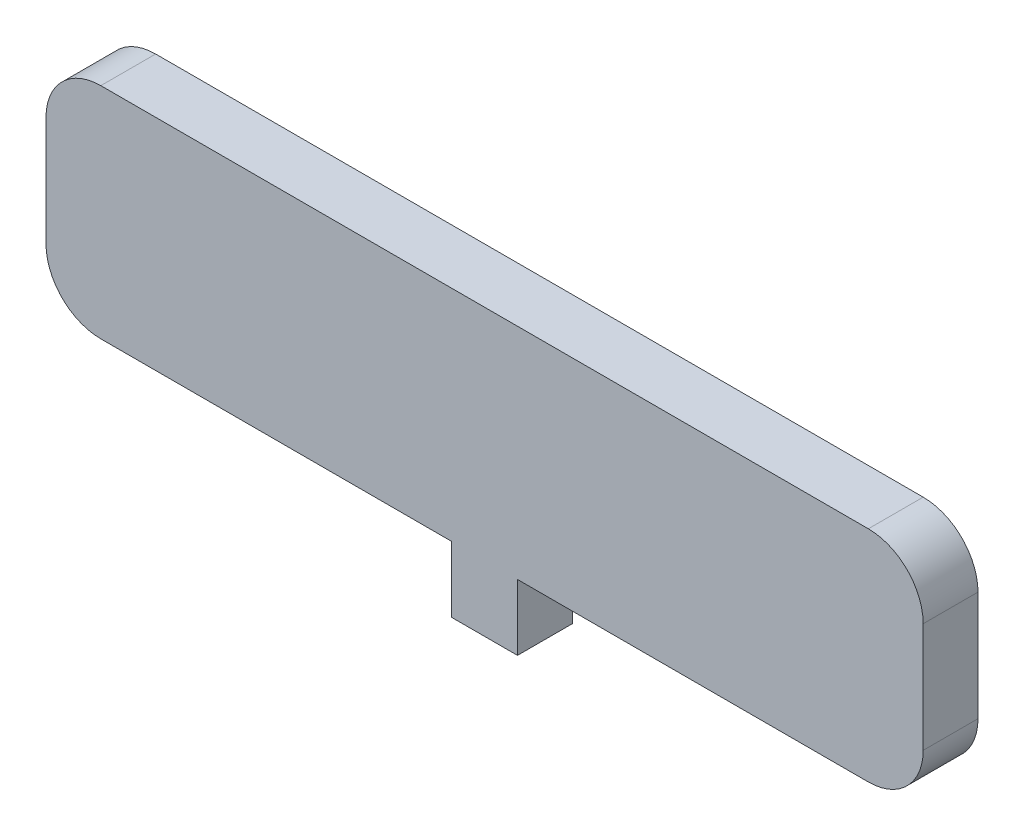
ISO-10303-21;
HEADER;
FILE_DESCRIPTION(('STEP AP214'),'2;1');
FILE_NAME('part.step','',(''),(''),'','','');
FILE_SCHEMA(('AUTOMOTIVE_DESIGN { 1 0 10303 214 1 1 1 1 }'));
ENDSEC;
DATA;
#1=APPLICATION_CONTEXT('core data for automotive mechanical design processes');
#2=APPLICATION_PROTOCOL_DEFINITION('international standard','automotive_design',2000,#1);
#3=PRODUCT_CONTEXT('',#1,'mechanical');
#4=PRODUCT('Part','Part','',(#3));
#5=PRODUCT_RELATED_PRODUCT_CATEGORY('part','',(#4));
#6=PRODUCT_DEFINITION_FORMATION('','',#4);
#7=PRODUCT_DEFINITION_CONTEXT('part definition',#1,'design');
#8=PRODUCT_DEFINITION('design','',#6,#7);
#9=PRODUCT_DEFINITION_SHAPE('','',#8);
#10=(LENGTH_UNIT() NAMED_UNIT(*) SI_UNIT(.MILLI.,.METRE.));
#11=(NAMED_UNIT(*) PLANE_ANGLE_UNIT() SI_UNIT($,.RADIAN.));
#12=(NAMED_UNIT(*) SI_UNIT($,.STERADIAN.) SOLID_ANGLE_UNIT());
#13=UNCERTAINTY_MEASURE_WITH_UNIT(LENGTH_MEASURE(1.E-05),#10,'distance_accuracy_value','');
#14=(GEOMETRIC_REPRESENTATION_CONTEXT(3) GLOBAL_UNCERTAINTY_ASSIGNED_CONTEXT((#13)) GLOBAL_UNIT_ASSIGNED_CONTEXT((#10,
#11,#12)) REPRESENTATION_CONTEXT('',''));
#15=CARTESIAN_POINT('',(0.,0.,0.));
#16=DIRECTION('',(0.,0.,1.));
#17=DIRECTION('',(1.,0.,0.));
#18=AXIS2_PLACEMENT_3D('',#15,#16,#17);
#19=CARTESIAN_POINT('',(-40.,-10.,5.));
#20=DIRECTION('',(0.,1.,0.));
#21=DIRECTION('',(0.,0.,1.));
#22=AXIS2_PLACEMENT_3D('',#19,#20,#21);
#23=PLANE('',#22);
#24=DIRECTION('',(0.,0.,1.));
#25=VECTOR('',#24,1.);
#26=CARTESIAN_POINT('',(3.,-10.,0.));
#27=LINE('',#26,#25);
#28=CARTESIAN_POINT('',(3.,-10.,0.));
#29=VERTEX_POINT('',#28);
#30=CARTESIAN_POINT('',(3.,-10.,5.));
#31=VERTEX_POINT('',#30);
#32=EDGE_CURVE('E55',#29,#31,#27,.T.);
#33=ORIENTED_EDGE('',*,*,#32,.F.);
#34=DIRECTION('',(1.,0.,0.));
#35=VECTOR('',#34,1.);
#36=CARTESIAN_POINT('',(-40.,-10.,0.));
#37=LINE('',#36,#35);
#38=CARTESIAN_POINT('',(35.,-10.,0.));
#39=VERTEX_POINT('',#38);
#40=EDGE_CURVE('E317',#29,#39,#37,.T.);
#41=ORIENTED_EDGE('',*,*,#40,.T.);
#42=DIRECTION('',(0.,0.,-1.));
#43=VECTOR('',#42,1.);
#44=CARTESIAN_POINT('',(35.,-10.,5.));
#45=LINE('',#44,#43);
#46=CARTESIAN_POINT('',(35.,-10.,5.));
#47=VERTEX_POINT('',#46);
#48=EDGE_CURVE('E359',#39,#47,#45,.F.);
#49=ORIENTED_EDGE('',*,*,#48,.T.);
#50=DIRECTION('',(1.,0.,0.));
#51=VECTOR('',#50,1.);
#52=CARTESIAN_POINT('',(-40.,-10.,5.));
#53=LINE('',#52,#51);
#54=EDGE_CURVE('E301',#31,#47,#53,.T.);
#55=ORIENTED_EDGE('',*,*,#54,.F.);
#56=EDGE_LOOP('',(#33,#41,#49,#55));
#57=FACE_BOUND('',#56,.T.);
#58=ADVANCED_FACE('F39',(#57),#23,.F.);
#59=CARTESIAN_POINT('',(0.,0.,0.));
#60=DIRECTION('',(0.,0.,1.));
#61=DIRECTION('',(1.,0.,0.));
#62=AXIS2_PLACEMENT_3D('',#59,#60,#61);
#63=PLANE('',#62);
#64=DIRECTION('',(0.,-1.,0.));
#65=VECTOR('',#64,1.);
#66=CARTESIAN_POINT('',(-40.,10.,0.));
#67=LINE('',#66,#65);
#68=CARTESIAN_POINT('',(-40.,5.,0.));
#69=VERTEX_POINT('',#68);
#70=CARTESIAN_POINT('',(-40.,-5.,0.));
#71=VERTEX_POINT('',#70);
#72=EDGE_CURVE('E313',#69,#71,#67,.T.);
#73=ORIENTED_EDGE('',*,*,#72,.F.);
#74=CARTESIAN_POINT('',(-35.,5.,0.));
#75=DIRECTION('',(0.,0.,1.));
#76=DIRECTION('',(1.,0.,0.));
#77=AXIS2_PLACEMENT_3D('',#74,#75,#76);
#78=CIRCLE('',#77,5.);
#79=CARTESIAN_POINT('',(-35.,10.,0.));
#80=VERTEX_POINT('',#79);
#81=EDGE_CURVE('E337',#69,#80,#78,.F.);
#82=ORIENTED_EDGE('',*,*,#81,.T.);
#83=DIRECTION('',(-1.,0.,0.));
#84=VECTOR('',#83,1.);
#85=CARTESIAN_POINT('',(-40.,10.,0.));
#86=LINE('',#85,#84);
#87=CARTESIAN_POINT('',(35.,10.,0.));
#88=VERTEX_POINT('',#87);
#89=EDGE_CURVE('E309',#88,#80,#86,.T.);
#90=ORIENTED_EDGE('',*,*,#89,.F.);
#91=CARTESIAN_POINT('',(35.,5.,0.));
#92=DIRECTION('',(0.,0.,1.));
#93=DIRECTION('',(1.,0.,0.));
#94=AXIS2_PLACEMENT_3D('',#91,#92,#93);
#95=CIRCLE('',#94,5.);
#96=CARTESIAN_POINT('',(40.,5.,0.));
#97=VERTEX_POINT('',#96);
#98=EDGE_CURVE('E327',#88,#97,#95,.F.);
#99=ORIENTED_EDGE('',*,*,#98,.T.);
#100=DIRECTION('',(0.,1.,0.));
#101=VECTOR('',#100,1.);
#102=CARTESIAN_POINT('',(40.,10.,0.));
#103=LINE('',#102,#101);
#104=CARTESIAN_POINT('',(40.,-5.,0.));
#105=VERTEX_POINT('',#104);
#106=EDGE_CURVE('E223',#105,#97,#103,.T.);
#107=ORIENTED_EDGE('',*,*,#106,.F.);
#108=CARTESIAN_POINT('',(35.,-5.,0.));
#109=DIRECTION('',(0.,0.,1.));
#110=DIRECTION('',(1.,0.,0.));
#111=AXIS2_PLACEMENT_3D('',#108,#109,#110);
#112=CIRCLE('',#111,5.);
#113=EDGE_CURVE('E330',#105,#39,#112,.F.);
#114=ORIENTED_EDGE('',*,*,#113,.T.);
#115=ORIENTED_EDGE('',*,*,#40,.F.);
#116=DIRECTION('',(0.,1.,0.));
#117=VECTOR('',#116,1.);
#118=CARTESIAN_POINT('',(3.,-16.,0.));
#119=LINE('',#118,#117);
#120=CARTESIAN_POINT('',(3.,-16.,0.));
#121=VERTEX_POINT('',#120);
#122=EDGE_CURVE('E406',#121,#29,#119,.T.);
#123=ORIENTED_EDGE('',*,*,#122,.F.);
#124=DIRECTION('',(-1.,0.,0.));
#125=VECTOR('',#124,1.);
#126=CARTESIAN_POINT('',(3.,-16.,0.));
#127=LINE('',#126,#125);
#128=CARTESIAN_POINT('',(-3.,-16.,0.));
#129=VERTEX_POINT('',#128);
#130=EDGE_CURVE('E198',#121,#129,#127,.T.);
#131=ORIENTED_EDGE('',*,*,#130,.T.);
#132=DIRECTION('',(0.,1.,0.));
#133=VECTOR('',#132,1.);
#134=CARTESIAN_POINT('',(-3.,-16.,0.));
#135=LINE('',#134,#133);
#136=CARTESIAN_POINT('',(-3.,-10.,0.));
#137=VERTEX_POINT('',#136);
#138=EDGE_CURVE('E211',#129,#137,#135,.T.);
#139=ORIENTED_EDGE('',*,*,#138,.T.);
#140=CARTESIAN_POINT('',(-35.,-10.,0.));
#141=VERTEX_POINT('',#140);
#142=EDGE_CURVE('E294',#141,#137,#37,.T.);
#143=ORIENTED_EDGE('',*,*,#142,.F.);
#144=CARTESIAN_POINT('',(-35.,-5.,0.));
#145=DIRECTION('',(0.,0.,1.));
#146=DIRECTION('',(1.,0.,0.));
#147=AXIS2_PLACEMENT_3D('',#144,#145,#146);
#148=CIRCLE('',#147,5.);
#149=EDGE_CURVE('E334',#141,#71,#148,.F.);
#150=ORIENTED_EDGE('',*,*,#149,.T.);
#151=EDGE_LOOP('',(#73,#82,#90,#99,#107,#114,#115,#123,#131,#139,#143,#150));
#152=FACE_BOUND('',#151,.T.);
#153=CARTESIAN_POINT('',(-35.,5.,0.));
#154=DIRECTION('',(0.,0.,1.));
#155=DIRECTION('',(1.,0.,0.));
#156=AXIS2_PLACEMENT_3D('',#153,#154,#155);
#157=CIRCLE('',#156,3.);
#158=CARTESIAN_POINT('',(-38.,5.,0.));
#159=VERTEX_POINT('',#158);
#160=CARTESIAN_POINT('',(-35.,8.,0.));
#161=VERTEX_POINT('',#160);
#162=EDGE_CURVE('E259',#159,#161,#157,.F.);
#163=ORIENTED_EDGE('',*,*,#162,.F.);
#164=DIRECTION('',(0.,-1.,0.));
#165=VECTOR('',#164,1.);
#166=CARTESIAN_POINT('',(-38.,10.,0.));
#167=LINE('',#166,#165);
#168=CARTESIAN_POINT('',(-38.,-5.,0.));
#169=VERTEX_POINT('',#168);
#170=EDGE_CURVE('E276',#159,#169,#167,.T.);
#171=ORIENTED_EDGE('',*,*,#170,.T.);
#172=CARTESIAN_POINT('',(-35.,-5.,0.));
#173=DIRECTION('',(0.,0.,1.));
#174=DIRECTION('',(1.,0.,0.));
#175=AXIS2_PLACEMENT_3D('',#172,#173,#174);
#176=CIRCLE('',#175,3.);
#177=CARTESIAN_POINT('',(-35.,-8.,0.));
#178=VERTEX_POINT('',#177);
#179=EDGE_CURVE('E273',#178,#169,#176,.F.);
#180=ORIENTED_EDGE('',*,*,#179,.F.);
#181=DIRECTION('',(1.,0.,0.));
#182=VECTOR('',#181,1.);
#183=CARTESIAN_POINT('',(-40.,-8.,0.));
#184=LINE('',#183,#182);
#185=CARTESIAN_POINT('',(35.,-8.,0.));
#186=VERTEX_POINT('',#185);
#187=EDGE_CURVE('E63',#178,#186,#184,.T.);
#188=ORIENTED_EDGE('',*,*,#187,.T.);
#189=CARTESIAN_POINT('',(35.,-5.,0.));
#190=DIRECTION('',(0.,0.,1.));
#191=DIRECTION('',(1.,0.,0.));
#192=AXIS2_PLACEMENT_3D('',#189,#190,#191);
#193=CIRCLE('',#192,3.);
#194=CARTESIAN_POINT('',(38.,-5.,0.));
#195=VERTEX_POINT('',#194);
#196=EDGE_CURVE('E270',#195,#186,#193,.F.);
#197=ORIENTED_EDGE('',*,*,#196,.F.);
#198=DIRECTION('',(0.,1.,0.));
#199=VECTOR('',#198,1.);
#200=CARTESIAN_POINT('',(38.,10.,0.));
#201=LINE('',#200,#199);
#202=CARTESIAN_POINT('',(38.,5.,0.));
#203=VERTEX_POINT('',#202);
#204=EDGE_CURVE('E204',#195,#203,#201,.T.);
#205=ORIENTED_EDGE('',*,*,#204,.T.);
#206=CARTESIAN_POINT('',(35.,5.,0.));
#207=DIRECTION('',(0.,0.,1.));
#208=DIRECTION('',(1.,0.,0.));
#209=AXIS2_PLACEMENT_3D('',#206,#207,#208);
#210=CIRCLE('',#209,3.);
#211=CARTESIAN_POINT('',(35.,8.,0.));
#212=VERTEX_POINT('',#211);
#213=EDGE_CURVE('E263',#212,#203,#210,.F.);
#214=ORIENTED_EDGE('',*,*,#213,.F.);
#215=DIRECTION('',(-1.,0.,0.));
#216=VECTOR('',#215,1.);
#217=CARTESIAN_POINT('',(-40.,8.,0.));
#218=LINE('',#217,#216);
#219=EDGE_CURVE('E209',#212,#161,#218,.T.);
#220=ORIENTED_EDGE('',*,*,#219,.T.);
#221=EDGE_LOOP('',(#163,#171,#180,#188,#197,#205,#214,#220));
#222=FACE_BOUND('',#221,.T.);
#223=ADVANCED_FACE('F384',(#152,#222),#63,.F.);
#224=CARTESIAN_POINT('',(40.,10.,5.));
#225=DIRECTION('',(-1.,0.,0.));
#226=DIRECTION('',(0.,0.,1.));
#227=AXIS2_PLACEMENT_3D('',#224,#225,#226);
#228=PLANE('',#227);
#229=DIRECTION('',(0.,1.,0.));
#230=VECTOR('',#229,1.);
#231=CARTESIAN_POINT('',(40.,10.,5.));
#232=LINE('',#231,#230);
#233=CARTESIAN_POINT('',(40.,-5.,5.));
#234=VERTEX_POINT('',#233);
#235=CARTESIAN_POINT('',(40.,5.,5.));
#236=VERTEX_POINT('',#235);
#237=EDGE_CURVE('E289',#234,#236,#232,.T.);
#238=ORIENTED_EDGE('',*,*,#237,.F.);
#239=DIRECTION('',(0.,0.,-1.));
#240=VECTOR('',#239,1.);
#241=CARTESIAN_POINT('',(40.,-5.,5.));
#242=LINE('',#241,#240);
#243=EDGE_CURVE('E11',#234,#105,#242,.T.);
#244=ORIENTED_EDGE('',*,*,#243,.T.);
#245=ORIENTED_EDGE('',*,*,#106,.T.);
#246=DIRECTION('',(0.,0.,-1.));
#247=VECTOR('',#246,1.);
#248=CARTESIAN_POINT('',(40.,5.,5.));
#249=LINE('',#248,#247);
#250=EDGE_CURVE('E48',#97,#236,#249,.F.);
#251=ORIENTED_EDGE('',*,*,#250,.T.);
#252=EDGE_LOOP('',(#238,#244,#245,#251));
#253=FACE_BOUND('',#252,.T.);
#254=ADVANCED_FACE('F370',(#253),#228,.F.);
#255=CARTESIAN_POINT('',(-40.,10.,5.));
#256=DIRECTION('',(0.,-1.,0.));
#257=DIRECTION('',(0.,0.,-1.));
#258=AXIS2_PLACEMENT_3D('',#255,#256,#257);
#259=PLANE('',#258);
#260=ORIENTED_EDGE('',*,*,#89,.T.);
#261=DIRECTION('',(0.,0.,-1.));
#262=VECTOR('',#261,1.);
#263=CARTESIAN_POINT('',(-35.,10.,5.));
#264=LINE('',#263,#262);
#265=CARTESIAN_POINT('',(-35.,10.,5.));
#266=VERTEX_POINT('',#265);
#267=EDGE_CURVE('E344',#80,#266,#264,.F.);
#268=ORIENTED_EDGE('',*,*,#267,.T.);
#269=DIRECTION('',(-1.,0.,0.));
#270=VECTOR('',#269,1.);
#271=CARTESIAN_POINT('',(-40.,10.,5.));
#272=LINE('',#271,#270);
#273=CARTESIAN_POINT('',(35.,10.,5.));
#274=VERTEX_POINT('',#273);
#275=EDGE_CURVE('E293',#274,#266,#272,.T.);
#276=ORIENTED_EDGE('',*,*,#275,.F.);
#277=DIRECTION('',(0.,0.,-1.));
#278=VECTOR('',#277,1.);
#279=CARTESIAN_POINT('',(35.,10.,5.));
#280=LINE('',#279,#278);
#281=EDGE_CURVE('E340',#274,#88,#280,.T.);
#282=ORIENTED_EDGE('',*,*,#281,.T.);
#283=EDGE_LOOP('',(#260,#268,#276,#282));
#284=FACE_BOUND('',#283,.T.);
#285=ADVANCED_FACE('F380',(#284),#259,.F.);
#286=CARTESIAN_POINT('',(-40.,10.,5.));
#287=DIRECTION('',(1.,0.,0.));
#288=DIRECTION('',(0.,1.,0.));
#289=AXIS2_PLACEMENT_3D('',#286,#287,#288);
#290=PLANE('',#289);
#291=DIRECTION('',(0.,-1.,0.));
#292=VECTOR('',#291,1.);
#293=CARTESIAN_POINT('',(-40.,10.,5.));
#294=LINE('',#293,#292);
#295=CARTESIAN_POINT('',(-40.,5.,5.));
#296=VERTEX_POINT('',#295);
#297=CARTESIAN_POINT('',(-40.,-5.,5.));
#298=VERTEX_POINT('',#297);
#299=EDGE_CURVE('E297',#296,#298,#294,.T.);
#300=ORIENTED_EDGE('',*,*,#299,.F.);
#301=DIRECTION('',(0.,0.,-1.));
#302=VECTOR('',#301,1.);
#303=CARTESIAN_POINT('',(-40.,5.,5.));
#304=LINE('',#303,#302);
#305=EDGE_CURVE('E323',#296,#69,#304,.T.);
#306=ORIENTED_EDGE('',*,*,#305,.T.);
#307=ORIENTED_EDGE('',*,*,#72,.T.);
#308=DIRECTION('',(0.,0.,-1.));
#309=VECTOR('',#308,1.);
#310=CARTESIAN_POINT('',(-40.,-5.,5.));
#311=LINE('',#310,#309);
#312=EDGE_CURVE('E305',#71,#298,#311,.F.);
#313=ORIENTED_EDGE('',*,*,#312,.T.);
#314=EDGE_LOOP('',(#300,#306,#307,#313));
#315=FACE_BOUND('',#314,.T.);
#316=ADVANCED_FACE('F392',(#315),#290,.F.);
#317=ORIENTED_EDGE('',*,*,#142,.T.);
#318=DIRECTION('',(0.,0.,1.));
#319=VECTOR('',#318,1.);
#320=CARTESIAN_POINT('',(-3.,-10.,0.));
#321=LINE('',#320,#319);
#322=CARTESIAN_POINT('',(-3.,-10.,5.));
#323=VERTEX_POINT('',#322);
#324=EDGE_CURVE('E200',#137,#323,#321,.T.);
#325=ORIENTED_EDGE('',*,*,#324,.T.);
#326=CARTESIAN_POINT('',(-35.,-10.,5.));
#327=VERTEX_POINT('',#326);
#328=EDGE_CURVE('E302',#327,#323,#53,.T.);
#329=ORIENTED_EDGE('',*,*,#328,.F.);
#330=DIRECTION('',(0.,0.,-1.));
#331=VECTOR('',#330,1.);
#332=CARTESIAN_POINT('',(-35.,-10.,5.));
#333=LINE('',#332,#331);
#334=EDGE_CURVE('E363',#327,#141,#333,.T.);
#335=ORIENTED_EDGE('',*,*,#334,.T.);
#336=EDGE_LOOP('',(#317,#325,#329,#335));
#337=FACE_BOUND('',#336,.T.);
#338=ADVANCED_FACE('F401',(#337),#23,.F.);
#339=CARTESIAN_POINT('',(0.,0.,5.));
#340=DIRECTION('',(0.,0.,1.));
#341=DIRECTION('',(1.,0.,0.));
#342=AXIS2_PLACEMENT_3D('',#339,#340,#341);
#343=PLANE('',#342);
#344=ORIENTED_EDGE('',*,*,#275,.T.);
#345=CARTESIAN_POINT('',(-35.,5.,5.));
#346=DIRECTION('',(0.,0.,1.));
#347=DIRECTION('',(1.,0.,0.));
#348=AXIS2_PLACEMENT_3D('',#345,#346,#347);
#349=CIRCLE('',#348,5.);
#350=EDGE_CURVE('E356',#266,#296,#349,.T.);
#351=ORIENTED_EDGE('',*,*,#350,.T.);
#352=ORIENTED_EDGE('',*,*,#299,.T.);
#353=CARTESIAN_POINT('',(-35.,-5.,5.));
#354=DIRECTION('',(0.,0.,1.));
#355=DIRECTION('',(1.,0.,0.));
#356=AXIS2_PLACEMENT_3D('',#353,#354,#355);
#357=CIRCLE('',#356,5.);
#358=EDGE_CURVE('E353',#298,#327,#357,.T.);
#359=ORIENTED_EDGE('',*,*,#358,.T.);
#360=ORIENTED_EDGE('',*,*,#328,.T.);
#361=DIRECTION('',(0.,1.,0.));
#362=VECTOR('',#361,1.);
#363=CARTESIAN_POINT('',(-3.,-16.,5.));
#364=LINE('',#363,#362);
#365=CARTESIAN_POINT('',(-3.,-16.,5.));
#366=VERTEX_POINT('',#365);
#367=EDGE_CURVE('E186',#366,#323,#364,.T.);
#368=ORIENTED_EDGE('',*,*,#367,.F.);
#369=DIRECTION('',(-1.,0.,0.));
#370=VECTOR('',#369,1.);
#371=CARTESIAN_POINT('',(3.,-16.,5.));
#372=LINE('',#371,#370);
#373=CARTESIAN_POINT('',(3.,-16.,5.));
#374=VERTEX_POINT('',#373);
#375=EDGE_CURVE('E179',#374,#366,#372,.T.);
#376=ORIENTED_EDGE('',*,*,#375,.F.);
#377=DIRECTION('',(0.,1.,0.));
#378=VECTOR('',#377,1.);
#379=CARTESIAN_POINT('',(3.,-16.,5.));
#380=LINE('',#379,#378);
#381=EDGE_CURVE('E183',#374,#31,#380,.T.);
#382=ORIENTED_EDGE('',*,*,#381,.T.);
#383=ORIENTED_EDGE('',*,*,#54,.T.);
#384=CARTESIAN_POINT('',(35.,-5.,5.));
#385=DIRECTION('',(0.,0.,1.));
#386=DIRECTION('',(1.,0.,0.));
#387=AXIS2_PLACEMENT_3D('',#384,#385,#386);
#388=CIRCLE('',#387,5.);
#389=EDGE_CURVE('E350',#47,#234,#388,.T.);
#390=ORIENTED_EDGE('',*,*,#389,.T.);
#391=ORIENTED_EDGE('',*,*,#237,.T.);
#392=CARTESIAN_POINT('',(35.,5.,5.));
#393=DIRECTION('',(0.,0.,1.));
#394=DIRECTION('',(1.,0.,0.));
#395=AXIS2_PLACEMENT_3D('',#392,#393,#394);
#396=CIRCLE('',#395,5.);
#397=EDGE_CURVE('E347',#236,#274,#396,.T.);
#398=ORIENTED_EDGE('',*,*,#397,.T.);
#399=EDGE_LOOP('',(#344,#351,#352,#359,#360,#368,#376,#382,#383,#390,#391,#398));
#400=FACE_BOUND('',#399,.T.);
#401=ADVANCED_FACE('F182',(#400),#343,.T.);
#402=CARTESIAN_POINT('',(-35.,5.,5.));
#403=DIRECTION('',(0.,0.,-1.));
#404=DIRECTION('',(-1.,0.,0.));
#405=AXIS2_PLACEMENT_3D('',#402,#403,#404);
#406=CYLINDRICAL_SURFACE('',#405,5.);
#407=ORIENTED_EDGE('',*,*,#350,.F.);
#408=ORIENTED_EDGE('',*,*,#267,.F.);
#409=ORIENTED_EDGE('',*,*,#81,.F.);
#410=ORIENTED_EDGE('',*,*,#305,.F.);
#411=EDGE_LOOP('',(#407,#408,#409,#410));
#412=FACE_BOUND('',#411,.T.);
#413=ADVANCED_FACE('F389',(#412),#406,.T.);
#414=CARTESIAN_POINT('',(-35.,-5.,5.));
#415=DIRECTION('',(0.,0.,-1.));
#416=DIRECTION('',(-1.,0.,0.));
#417=AXIS2_PLACEMENT_3D('',#414,#415,#416);
#418=CYLINDRICAL_SURFACE('',#417,5.);
#419=ORIENTED_EDGE('',*,*,#358,.F.);
#420=ORIENTED_EDGE('',*,*,#312,.F.);
#421=ORIENTED_EDGE('',*,*,#149,.F.);
#422=ORIENTED_EDGE('',*,*,#334,.F.);
#423=EDGE_LOOP('',(#419,#420,#421,#422));
#424=FACE_BOUND('',#423,.T.);
#425=ADVANCED_FACE('F398',(#424),#418,.T.);
#426=CARTESIAN_POINT('',(35.,-5.,5.));
#427=DIRECTION('',(0.,0.,-1.));
#428=DIRECTION('',(-1.,0.,0.));
#429=AXIS2_PLACEMENT_3D('',#426,#427,#428);
#430=CYLINDRICAL_SURFACE('',#429,5.);
#431=ORIENTED_EDGE('',*,*,#389,.F.);
#432=ORIENTED_EDGE('',*,*,#48,.F.);
#433=ORIENTED_EDGE('',*,*,#113,.F.);
#434=ORIENTED_EDGE('',*,*,#243,.F.);
#435=EDGE_LOOP('',(#431,#432,#433,#434));
#436=FACE_BOUND('',#435,.T.);
#437=ADVANCED_FACE('F466',(#436),#430,.T.);
#438=CARTESIAN_POINT('',(35.,5.,5.));
#439=DIRECTION('',(0.,0.,-1.));
#440=DIRECTION('',(-1.,0.,0.));
#441=AXIS2_PLACEMENT_3D('',#438,#439,#440);
#442=CYLINDRICAL_SURFACE('',#441,5.);
#443=ORIENTED_EDGE('',*,*,#397,.F.);
#444=ORIENTED_EDGE('',*,*,#250,.F.);
#445=ORIENTED_EDGE('',*,*,#98,.F.);
#446=ORIENTED_EDGE('',*,*,#281,.F.);
#447=EDGE_LOOP('',(#443,#444,#445,#446));
#448=FACE_BOUND('',#447,.T.);
#449=ADVANCED_FACE('F41',(#448),#442,.T.);
#450=CARTESIAN_POINT('',(38.,10.,5.));
#451=DIRECTION('',(-1.,0.,0.));
#452=DIRECTION('',(0.,0.,1.));
#453=AXIS2_PLACEMENT_3D('',#450,#451,#452);
#454=PLANE('',#453);
#455=DIRECTION('',(0.,1.,0.));
#456=VECTOR('',#455,1.);
#457=CARTESIAN_POINT('',(38.,10.,3.));
#458=LINE('',#457,#456);
#459=CARTESIAN_POINT('',(38.,-5.,3.));
#460=VERTEX_POINT('',#459);
#461=CARTESIAN_POINT('',(38.,5.,3.));
#462=VERTEX_POINT('',#461);
#463=EDGE_CURVE('E215',#460,#462,#458,.T.);
#464=ORIENTED_EDGE('',*,*,#463,.T.);
#465=DIRECTION('',(0.,0.,1.));
#466=VECTOR('',#465,1.);
#467=CARTESIAN_POINT('',(38.,5.,5.));
#468=LINE('',#467,#466);
#469=EDGE_CURVE('E224',#203,#462,#468,.T.);
#470=ORIENTED_EDGE('',*,*,#469,.F.);
#471=ORIENTED_EDGE('',*,*,#204,.F.);
#472=DIRECTION('',(0.,0.,1.));
#473=VECTOR('',#472,1.);
#474=CARTESIAN_POINT('',(38.,-5.,5.));
#475=LINE('',#474,#473);
#476=EDGE_CURVE('E220',#460,#195,#475,.F.);
#477=ORIENTED_EDGE('',*,*,#476,.F.);
#478=EDGE_LOOP('',(#464,#470,#471,#477));
#479=FACE_BOUND('',#478,.T.);
#480=ADVANCED_FACE('F472',(#479),#454,.T.);
#481=CARTESIAN_POINT('',(-40.,8.,5.));
#482=DIRECTION('',(0.,-1.,0.));
#483=DIRECTION('',(0.,0.,-1.));
#484=AXIS2_PLACEMENT_3D('',#481,#482,#483);
#485=PLANE('',#484);
#486=ORIENTED_EDGE('',*,*,#219,.F.);
#487=DIRECTION('',(0.,0.,-1.));
#488=VECTOR('',#487,1.);
#489=CARTESIAN_POINT('',(35.,8.,5.));
#490=LINE('',#489,#488);
#491=CARTESIAN_POINT('',(35.,8.,3.));
#492=VERTEX_POINT('',#491);
#493=EDGE_CURVE('E256',#492,#212,#490,.T.);
#494=ORIENTED_EDGE('',*,*,#493,.F.);
#495=DIRECTION('',(-1.,0.,0.));
#496=VECTOR('',#495,1.);
#497=CARTESIAN_POINT('',(-40.,8.,3.));
#498=LINE('',#497,#496);
#499=CARTESIAN_POINT('',(-35.,8.,3.));
#500=VERTEX_POINT('',#499);
#501=EDGE_CURVE('E219',#492,#500,#498,.T.);
#502=ORIENTED_EDGE('',*,*,#501,.T.);
#503=DIRECTION('',(0.,0.,-1.));
#504=VECTOR('',#503,1.);
#505=CARTESIAN_POINT('',(-35.,8.,5.));
#506=LINE('',#505,#504);
#507=EDGE_CURVE('E253',#161,#500,#506,.F.);
#508=ORIENTED_EDGE('',*,*,#507,.F.);
#509=EDGE_LOOP('',(#486,#494,#502,#508));
#510=FACE_BOUND('',#509,.T.);
#511=ADVANCED_FACE('F480',(#510),#485,.T.);
#512=CARTESIAN_POINT('',(-38.,10.,5.));
#513=DIRECTION('',(1.,0.,0.));
#514=DIRECTION('',(0.,1.,0.));
#515=AXIS2_PLACEMENT_3D('',#512,#513,#514);
#516=PLANE('',#515);
#517=DIRECTION('',(0.,-1.,0.));
#518=VECTOR('',#517,1.);
#519=CARTESIAN_POINT('',(-38.,10.,3.));
#520=LINE('',#519,#518);
#521=CARTESIAN_POINT('',(-38.,5.,3.));
#522=VERTEX_POINT('',#521);
#523=CARTESIAN_POINT('',(-38.,-5.,3.));
#524=VERTEX_POINT('',#523);
#525=EDGE_CURVE('E231',#522,#524,#520,.T.);
#526=ORIENTED_EDGE('',*,*,#525,.T.);
#527=DIRECTION('',(0.,0.,1.));
#528=VECTOR('',#527,1.);
#529=CARTESIAN_POINT('',(-38.,-5.,5.));
#530=LINE('',#529,#528);
#531=EDGE_CURVE('E247',#169,#524,#530,.T.);
#532=ORIENTED_EDGE('',*,*,#531,.F.);
#533=ORIENTED_EDGE('',*,*,#170,.F.);
#534=DIRECTION('',(0.,0.,1.));
#535=VECTOR('',#534,1.);
#536=CARTESIAN_POINT('',(-38.,5.,5.));
#537=LINE('',#536,#535);
#538=EDGE_CURVE('E260',#522,#159,#537,.F.);
#539=ORIENTED_EDGE('',*,*,#538,.F.);
#540=EDGE_LOOP('',(#526,#532,#533,#539));
#541=FACE_BOUND('',#540,.T.);
#542=ADVANCED_FACE('F486',(#541),#516,.T.);
#543=CARTESIAN_POINT('',(-40.,-8.,5.));
#544=DIRECTION('',(0.,1.,0.));
#545=DIRECTION('',(0.,0.,1.));
#546=AXIS2_PLACEMENT_3D('',#543,#544,#545);
#547=PLANE('',#546);
#548=DIRECTION('',(1.,0.,0.));
#549=VECTOR('',#548,1.);
#550=CARTESIAN_POINT('',(-40.,-8.,3.));
#551=LINE('',#550,#549);
#552=CARTESIAN_POINT('',(-35.,-8.,3.));
#553=VERTEX_POINT('',#552);
#554=CARTESIAN_POINT('',(35.,-8.,3.));
#555=VERTEX_POINT('',#554);
#556=EDGE_CURVE('E240',#553,#555,#551,.T.);
#557=ORIENTED_EDGE('',*,*,#556,.T.);
#558=DIRECTION('',(0.,0.,1.));
#559=VECTOR('',#558,1.);
#560=CARTESIAN_POINT('',(35.,-8.,5.));
#561=LINE('',#560,#559);
#562=EDGE_CURVE('E235',#186,#555,#561,.T.);
#563=ORIENTED_EDGE('',*,*,#562,.F.);
#564=ORIENTED_EDGE('',*,*,#187,.F.);
#565=DIRECTION('',(0.,0.,1.));
#566=VECTOR('',#565,1.);
#567=CARTESIAN_POINT('',(-35.,-8.,5.));
#568=LINE('',#567,#566);
#569=EDGE_CURVE('E227',#553,#178,#568,.F.);
#570=ORIENTED_EDGE('',*,*,#569,.F.);
#571=EDGE_LOOP('',(#557,#563,#564,#570));
#572=FACE_BOUND('',#571,.T.);
#573=ADVANCED_FACE('F493',(#572),#547,.T.);
#574=CARTESIAN_POINT('',(0.,0.,3.));
#575=DIRECTION('',(0.,0.,1.));
#576=DIRECTION('',(1.,0.,0.));
#577=AXIS2_PLACEMENT_3D('',#574,#575,#576);
#578=PLANE('',#577);
#579=ORIENTED_EDGE('',*,*,#501,.F.);
#580=CARTESIAN_POINT('',(35.,5.,3.));
#581=DIRECTION('',(0.,0.,1.));
#582=DIRECTION('',(1.,0.,0.));
#583=AXIS2_PLACEMENT_3D('',#580,#581,#582);
#584=CIRCLE('',#583,3.);
#585=EDGE_CURVE('E250',#462,#492,#584,.T.);
#586=ORIENTED_EDGE('',*,*,#585,.F.);
#587=ORIENTED_EDGE('',*,*,#463,.F.);
#588=CARTESIAN_POINT('',(35.,-5.,3.));
#589=DIRECTION('',(0.,0.,1.));
#590=DIRECTION('',(1.,0.,0.));
#591=AXIS2_PLACEMENT_3D('',#588,#589,#590);
#592=CIRCLE('',#591,3.);
#593=EDGE_CURVE('E243',#555,#460,#592,.T.);
#594=ORIENTED_EDGE('',*,*,#593,.F.);
#595=ORIENTED_EDGE('',*,*,#556,.F.);
#596=CARTESIAN_POINT('',(-35.,-5.,3.));
#597=DIRECTION('',(0.,0.,1.));
#598=DIRECTION('',(1.,0.,0.));
#599=AXIS2_PLACEMENT_3D('',#596,#597,#598);
#600=CIRCLE('',#599,3.);
#601=EDGE_CURVE('E236',#524,#553,#600,.T.);
#602=ORIENTED_EDGE('',*,*,#601,.F.);
#603=ORIENTED_EDGE('',*,*,#525,.F.);
#604=CARTESIAN_POINT('',(-35.,5.,3.));
#605=DIRECTION('',(0.,0.,1.));
#606=DIRECTION('',(1.,0.,0.));
#607=AXIS2_PLACEMENT_3D('',#604,#605,#606);
#608=CIRCLE('',#607,3.);
#609=EDGE_CURVE('E232',#500,#522,#608,.T.);
#610=ORIENTED_EDGE('',*,*,#609,.F.);
#611=EDGE_LOOP('',(#579,#586,#587,#594,#595,#602,#603,#610));
#612=FACE_BOUND('',#611,.T.);
#613=ADVANCED_FACE('F497',(#612),#578,.F.);
#614=CARTESIAN_POINT('',(-35.,5.,5.));
#615=DIRECTION('',(0.,0.,-1.));
#616=DIRECTION('',(-1.,0.,0.));
#617=AXIS2_PLACEMENT_3D('',#614,#615,#616);
#618=CYLINDRICAL_SURFACE('',#617,3.);
#619=ORIENTED_EDGE('',*,*,#609,.T.);
#620=ORIENTED_EDGE('',*,*,#538,.T.);
#621=ORIENTED_EDGE('',*,*,#162,.T.);
#622=ORIENTED_EDGE('',*,*,#507,.T.);
#623=EDGE_LOOP('',(#619,#620,#621,#622));
#624=FACE_BOUND('',#623,.T.);
#625=ADVANCED_FACE('F500',(#624),#618,.F.);
#626=CARTESIAN_POINT('',(-35.,-5.,5.));
#627=DIRECTION('',(0.,0.,-1.));
#628=DIRECTION('',(-1.,0.,0.));
#629=AXIS2_PLACEMENT_3D('',#626,#627,#628);
#630=CYLINDRICAL_SURFACE('',#629,3.);
#631=ORIENTED_EDGE('',*,*,#601,.T.);
#632=ORIENTED_EDGE('',*,*,#569,.T.);
#633=ORIENTED_EDGE('',*,*,#179,.T.);
#634=ORIENTED_EDGE('',*,*,#531,.T.);
#635=EDGE_LOOP('',(#631,#632,#633,#634));
#636=FACE_BOUND('',#635,.T.);
#637=ADVANCED_FACE('F504',(#636),#630,.F.);
#638=CARTESIAN_POINT('',(35.,-5.,5.));
#639=DIRECTION('',(0.,0.,-1.));
#640=DIRECTION('',(-1.,0.,0.));
#641=AXIS2_PLACEMENT_3D('',#638,#639,#640);
#642=CYLINDRICAL_SURFACE('',#641,3.);
#643=ORIENTED_EDGE('',*,*,#593,.T.);
#644=ORIENTED_EDGE('',*,*,#476,.T.);
#645=ORIENTED_EDGE('',*,*,#196,.T.);
#646=ORIENTED_EDGE('',*,*,#562,.T.);
#647=EDGE_LOOP('',(#643,#644,#645,#646));
#648=FACE_BOUND('',#647,.T.);
#649=ADVANCED_FACE('F508',(#648),#642,.F.);
#650=CARTESIAN_POINT('',(35.,5.,5.));
#651=DIRECTION('',(0.,0.,-1.));
#652=DIRECTION('',(-1.,0.,0.));
#653=AXIS2_PLACEMENT_3D('',#650,#651,#652);
#654=CYLINDRICAL_SURFACE('',#653,3.);
#655=ORIENTED_EDGE('',*,*,#585,.T.);
#656=ORIENTED_EDGE('',*,*,#493,.T.);
#657=ORIENTED_EDGE('',*,*,#213,.T.);
#658=ORIENTED_EDGE('',*,*,#469,.T.);
#659=EDGE_LOOP('',(#655,#656,#657,#658));
#660=FACE_BOUND('',#659,.T.);
#661=ADVANCED_FACE('F512',(#660),#654,.F.);
#662=CARTESIAN_POINT('',(3.,-16.,0.));
#663=DIRECTION('',(-1.,0.,0.));
#664=DIRECTION('',(0.,0.,1.));
#665=AXIS2_PLACEMENT_3D('',#662,#663,#664);
#666=PLANE('',#665);
#667=ORIENTED_EDGE('',*,*,#32,.T.);
#668=ORIENTED_EDGE('',*,*,#381,.F.);
#669=DIRECTION('',(0.,0.,1.));
#670=VECTOR('',#669,1.);
#671=CARTESIAN_POINT('',(3.,-16.,0.));
#672=LINE('',#671,#670);
#673=EDGE_CURVE('E192',#121,#374,#672,.T.);
#674=ORIENTED_EDGE('',*,*,#673,.F.);
#675=ORIENTED_EDGE('',*,*,#122,.T.);
#676=EDGE_LOOP('',(#667,#668,#674,#675));
#677=FACE_BOUND('',#676,.T.);
#678=ADVANCED_FACE('F202',(#677),#666,.F.);
#679=CARTESIAN_POINT('',(-3.,-16.,0.));
#680=DIRECTION('',(-1.,0.,0.));
#681=DIRECTION('',(0.,0.,1.));
#682=AXIS2_PLACEMENT_3D('',#679,#680,#681);
#683=PLANE('',#682);
#684=ORIENTED_EDGE('',*,*,#324,.F.);
#685=ORIENTED_EDGE('',*,*,#138,.F.);
#686=DIRECTION('',(0.,0.,1.));
#687=VECTOR('',#686,1.);
#688=CARTESIAN_POINT('',(-3.,-16.,0.));
#689=LINE('',#688,#687);
#690=EDGE_CURVE('E191',#129,#366,#689,.T.);
#691=ORIENTED_EDGE('',*,*,#690,.T.);
#692=ORIENTED_EDGE('',*,*,#367,.T.);
#693=EDGE_LOOP('',(#684,#685,#691,#692));
#694=FACE_BOUND('',#693,.T.);
#695=ADVANCED_FACE('F407',(#694),#683,.T.);
#696=CARTESIAN_POINT('',(0.,-16.,0.));
#697=DIRECTION('',(0.,-1.,0.));
#698=DIRECTION('',(0.,0.,-1.));
#699=AXIS2_PLACEMENT_3D('',#696,#697,#698);
#700=PLANE('',#699);
#701=CARTESIAN_POINT('',(0.,-16.,2.5));
#702=DIRECTION('',(0.,-1.,0.));
#703=DIRECTION('',(0.,0.,-1.));
#704=AXIS2_PLACEMENT_3D('',#701,#702,#703);
#705=CIRCLE('',#704,1.425);
#706=CARTESIAN_POINT('',(0.,-16.,1.075));
#707=VERTEX_POINT('',#706);
#708=EDGE_CURVE('E420',#707,#707,#705,.T.);
#709=ORIENTED_EDGE('',*,*,#708,.F.);
#710=EDGE_LOOP('',(#709));
#711=FACE_BOUND('',#710,.T.);
#712=ORIENTED_EDGE('',*,*,#673,.T.);
#713=ORIENTED_EDGE('',*,*,#375,.T.);
#714=ORIENTED_EDGE('',*,*,#690,.F.);
#715=ORIENTED_EDGE('',*,*,#130,.F.);
#716=EDGE_LOOP('',(#712,#713,#714,#715));
#717=FACE_BOUND('',#716,.T.);
#718=ADVANCED_FACE('F196',(#711,#717),#700,.T.);
#719=CARTESIAN_POINT('',(0.,-12.,2.5));
#720=DIRECTION('',(0.,-1.,0.));
#721=DIRECTION('',(0.,0.,-1.));
#722=AXIS2_PLACEMENT_3D('',#719,#720,#721);
#723=CYLINDRICAL_SURFACE('',#722,1.425);
#724=CARTESIAN_POINT('',(0.,-12.,2.5));
#725=DIRECTION('',(0.,-1.,0.));
#726=DIRECTION('',(0.,0.,-1.));
#727=AXIS2_PLACEMENT_3D('',#724,#725,#726);
#728=CIRCLE('',#727,1.425);
#729=CARTESIAN_POINT('',(0.,-12.,1.075));
#730=VERTEX_POINT('',#729);
#731=EDGE_CURVE('E411',#730,#730,#728,.T.);
#732=ORIENTED_EDGE('',*,*,#731,.F.);
#733=EDGE_LOOP('',(#732));
#734=FACE_BOUND('',#733,.T.);
#735=ORIENTED_EDGE('',*,*,#708,.T.);
#736=EDGE_LOOP('',(#735));
#737=FACE_BOUND('',#736,.T.);
#738=ADVANCED_FACE('F430',(#734,#737),#723,.F.);
#739=CARTESIAN_POINT('',(0.,-12.,2.5));
#740=DIRECTION('',(0.,-1.,0.));
#741=DIRECTION('',(0.,0.,-1.));
#742=AXIS2_PLACEMENT_3D('',#739,#740,#741);
#743=PLANE('',#742);
#744=ORIENTED_EDGE('',*,*,#731,.T.);
#745=EDGE_LOOP('',(#744));
#746=FACE_BOUND('',#745,.T.);
#747=ADVANCED_FACE('F428',(#746),#743,.T.);
#748=CLOSED_SHELL('',(#58,#223,#254,#285,#316,#338,#401,#413,#425,#437,#449,#480,#511,#542,#573,
#613,#625,#637,#649,#661,#678,#695,#718,#738,#747));
#749=MANIFOLD_SOLID_BREP('B2',#748);
#750=ADVANCED_BREP_SHAPE_REPRESENTATION('',(#18,#749),#14);
#751=SHAPE_DEFINITION_REPRESENTATION(#9,#750);
ENDSEC;
END-ISO-10303-21;
